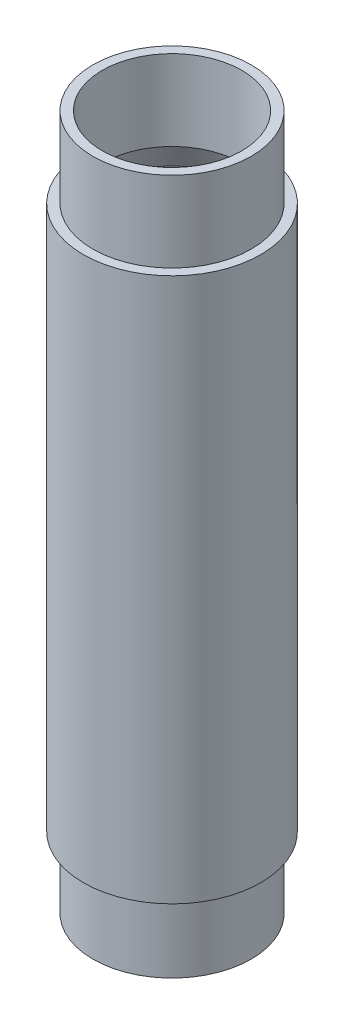
ISO-10303-21;
HEADER;
FILE_DESCRIPTION(('STEP AP214'),'2;1');
FILE_NAME('part.step','',(''),(''),'','','');
FILE_SCHEMA(('AUTOMOTIVE_DESIGN { 1 0 10303 214 1 1 1 1 }'));
ENDSEC;
DATA;
#1=APPLICATION_CONTEXT('core data for automotive mechanical design processes');
#2=APPLICATION_PROTOCOL_DEFINITION('international standard','automotive_design',2000,#1);
#3=PRODUCT_CONTEXT('',#1,'mechanical');
#4=PRODUCT('Part','Part','',(#3));
#5=PRODUCT_RELATED_PRODUCT_CATEGORY('part','',(#4));
#6=PRODUCT_DEFINITION_FORMATION('','',#4);
#7=PRODUCT_DEFINITION_CONTEXT('part definition',#1,'design');
#8=PRODUCT_DEFINITION('design','',#6,#7);
#9=PRODUCT_DEFINITION_SHAPE('','',#8);
#10=(LENGTH_UNIT() NAMED_UNIT(*) SI_UNIT(.MILLI.,.METRE.));
#11=(NAMED_UNIT(*) PLANE_ANGLE_UNIT() SI_UNIT($,.RADIAN.));
#12=(NAMED_UNIT(*) SI_UNIT($,.STERADIAN.) SOLID_ANGLE_UNIT());
#13=UNCERTAINTY_MEASURE_WITH_UNIT(LENGTH_MEASURE(1.E-05),#10,'distance_accuracy_value','');
#14=(GEOMETRIC_REPRESENTATION_CONTEXT(3) GLOBAL_UNCERTAINTY_ASSIGNED_CONTEXT((#13)) GLOBAL_UNIT_ASSIGNED_CONTEXT((#10,
#11,#12)) REPRESENTATION_CONTEXT('',''));
#15=CARTESIAN_POINT('',(0.,0.,0.));
#16=DIRECTION('',(0.,0.,1.));
#17=DIRECTION('',(1.,0.,0.));
#18=AXIS2_PLACEMENT_3D('',#15,#16,#17);
#19=CARTESIAN_POINT('',(0.,264.,0.));
#20=DIRECTION('',(0.,-1.,0.));
#21=DIRECTION('',(0.,0.,-1.));
#22=AXIS2_PLACEMENT_3D('',#19,#20,#21);
#23=CYLINDRICAL_SURFACE('',#22,33.5);
#24=CARTESIAN_POINT('',(0.,264.,0.));
#25=DIRECTION('',(0.,-1.,0.));
#26=DIRECTION('',(0.,0.,-1.));
#27=AXIS2_PLACEMENT_3D('',#24,#25,#26);
#28=CIRCLE('',#27,33.5);
#29=CARTESIAN_POINT('',(0.,264.,-33.5));
#30=VERTEX_POINT('',#29);
#31=EDGE_CURVE('E11',#30,#30,#28,.T.);
#32=ORIENTED_EDGE('',*,*,#31,.T.);
#33=EDGE_LOOP('',(#32));
#34=FACE_BOUND('',#33,.T.);
#35=CARTESIAN_POINT('',(0.,230.,0.));
#36=DIRECTION('',(0.,-1.,0.));
#37=DIRECTION('',(0.,0.,-1.));
#38=AXIS2_PLACEMENT_3D('',#35,#36,#37);
#39=CIRCLE('',#38,33.5);
#40=CARTESIAN_POINT('',(0.,230.,-33.5));
#41=VERTEX_POINT('',#40);
#42=EDGE_CURVE('E50',#41,#41,#39,.T.);
#43=ORIENTED_EDGE('',*,*,#42,.F.);
#44=EDGE_LOOP('',(#43));
#45=FACE_BOUND('',#44,.T.);
#46=ADVANCED_FACE('F47',(#34,#45),#23,.T.);
#47=CARTESIAN_POINT('',(0.,264.,0.));
#48=DIRECTION('',(0.,-1.,0.));
#49=DIRECTION('',(0.,0.,-1.));
#50=AXIS2_PLACEMENT_3D('',#47,#48,#49);
#51=PLANE('',#50);
#52=CARTESIAN_POINT('',(0.,264.,0.));
#53=DIRECTION('',(0.,-1.,0.));
#54=DIRECTION('',(0.,0.,-1.));
#55=AXIS2_PLACEMENT_3D('',#52,#53,#54);
#56=CIRCLE('',#55,29.5);
#57=CARTESIAN_POINT('',(0.,264.,-29.5));
#58=VERTEX_POINT('',#57);
#59=EDGE_CURVE('E57',#58,#58,#56,.T.);
#60=ORIENTED_EDGE('',*,*,#59,.T.);
#61=EDGE_LOOP('',(#60));
#62=FACE_BOUND('',#61,.T.);
#63=ORIENTED_EDGE('',*,*,#31,.F.);
#64=EDGE_LOOP('',(#63));
#65=FACE_BOUND('',#64,.T.);
#66=ADVANCED_FACE('F65',(#62,#65),#51,.F.);
#67=CARTESIAN_POINT('',(0.,230.,0.));
#68=DIRECTION('',(0.,-1.,0.));
#69=DIRECTION('',(0.,0.,-1.));
#70=AXIS2_PLACEMENT_3D('',#67,#68,#69);
#71=PLANE('',#70);
#72=CARTESIAN_POINT('',(0.,230.,0.));
#73=DIRECTION('',(0.,-1.,0.));
#74=DIRECTION('',(0.,0.,-1.));
#75=AXIS2_PLACEMENT_3D('',#72,#73,#74);
#76=CIRCLE('',#75,29.5);
#77=CARTESIAN_POINT('',(0.,230.,-29.5));
#78=VERTEX_POINT('',#77);
#79=EDGE_CURVE('E59',#78,#78,#76,.T.);
#80=ORIENTED_EDGE('',*,*,#79,.F.);
#81=EDGE_LOOP('',(#80));
#82=FACE_BOUND('',#81,.T.);
#83=ORIENTED_EDGE('',*,*,#42,.T.);
#84=EDGE_LOOP('',(#83));
#85=FACE_BOUND('',#84,.T.);
#86=ADVANCED_FACE('F71',(#82,#85),#71,.T.);
#87=CARTESIAN_POINT('',(0.,264.,0.));
#88=DIRECTION('',(0.,-1.,0.));
#89=DIRECTION('',(0.,0.,-1.));
#90=AXIS2_PLACEMENT_3D('',#87,#88,#89);
#91=CYLINDRICAL_SURFACE('',#90,29.5);
#92=ORIENTED_EDGE('',*,*,#59,.F.);
#93=EDGE_LOOP('',(#92));
#94=FACE_BOUND('',#93,.T.);
#95=ORIENTED_EDGE('',*,*,#79,.T.);
#96=EDGE_LOOP('',(#95));
#97=FACE_BOUND('',#96,.T.);
#98=ADVANCED_FACE('F68',(#94,#97),#91,.F.);
#99=CLOSED_SHELL('',(#46,#66,#86,#98));
#100=MANIFOLD_SOLID_BREP('B2',#99);
#101=CARTESIAN_POINT('',(0.,230.,0.));
#102=DIRECTION('',(0.,-1.,0.));
#103=DIRECTION('',(0.,0.,-1.));
#104=AXIS2_PLACEMENT_3D('',#101,#102,#103);
#105=CYLINDRICAL_SURFACE('',#104,33.5);
#106=CARTESIAN_POINT('',(0.,14.,0.));
#107=DIRECTION('',(0.,1.,0.));
#108=DIRECTION('',(0.,0.,1.));
#109=AXIS2_PLACEMENT_3D('',#106,#107,#108);
#110=CIRCLE('',#109,33.5);
#111=CARTESIAN_POINT('',(0.,14.,33.5));
#112=VERTEX_POINT('',#111);
#113=EDGE_CURVE('E46',#112,#112,#110,.T.);
#114=ORIENTED_EDGE('',*,*,#113,.F.);
#115=EDGE_LOOP('',(#114));
#116=FACE_BOUND('',#115,.T.);
#117=CARTESIAN_POINT('',(0.,220.,0.));
#118=DIRECTION('',(0.,-1.,0.));
#119=DIRECTION('',(0.,0.,-1.));
#120=AXIS2_PLACEMENT_3D('',#117,#118,#119);
#121=CIRCLE('',#120,33.5);
#122=CARTESIAN_POINT('',(0.,220.,-33.5));
#123=VERTEX_POINT('',#122);
#124=EDGE_CURVE('E124',#123,#123,#121,.T.);
#125=ORIENTED_EDGE('',*,*,#124,.F.);
#126=EDGE_LOOP('',(#125));
#127=FACE_BOUND('',#126,.T.);
#128=ADVANCED_FACE('F117',(#116,#127),#105,.F.);
#129=CARTESIAN_POINT('',(0.,230.,0.));
#130=DIRECTION('',(0.,1.,0.));
#131=DIRECTION('',(0.,0.,1.));
#132=AXIS2_PLACEMENT_3D('',#129,#130,#131);
#133=PLANE('',#132);
#134=CARTESIAN_POINT('',(0.,230.,0.));
#135=DIRECTION('',(0.,1.,0.));
#136=DIRECTION('',(0.,0.,1.));
#137=AXIS2_PLACEMENT_3D('',#134,#135,#136);
#138=CIRCLE('',#137,37.5);
#139=CARTESIAN_POINT('',(0.,230.,37.5));
#140=VERTEX_POINT('',#139);
#141=EDGE_CURVE('E128',#140,#140,#138,.T.);
#142=ORIENTED_EDGE('',*,*,#141,.T.);
#143=EDGE_LOOP('',(#142));
#144=FACE_BOUND('',#143,.T.);
#145=CARTESIAN_POINT('',(0.,230.,0.));
#146=DIRECTION('',(0.,1.,0.));
#147=DIRECTION('',(0.,0.,1.));
#148=AXIS2_PLACEMENT_3D('',#145,#146,#147);
#149=CIRCLE('',#148,29.5);
#150=CARTESIAN_POINT('',(0.,230.,29.5));
#151=VERTEX_POINT('',#150);
#152=EDGE_CURVE('E149',#151,#151,#149,.T.);
#153=ORIENTED_EDGE('',*,*,#152,.F.);
#154=EDGE_LOOP('',(#153));
#155=FACE_BOUND('',#154,.T.);
#156=ADVANCED_FACE('F155',(#144,#155),#133,.T.);
#157=CARTESIAN_POINT('',(0.,0.,0.));
#158=DIRECTION('',(0.,1.,0.));
#159=DIRECTION('',(0.,0.,1.));
#160=AXIS2_PLACEMENT_3D('',#157,#158,#159);
#161=PLANE('',#160);
#162=CARTESIAN_POINT('',(0.,0.,0.));
#163=DIRECTION('',(0.,1.,0.));
#164=DIRECTION('',(0.,0.,1.));
#165=AXIS2_PLACEMENT_3D('',#162,#163,#164);
#166=CIRCLE('',#165,37.5);
#167=CARTESIAN_POINT('',(0.,0.,37.5));
#168=VERTEX_POINT('',#167);
#169=EDGE_CURVE('E132',#168,#168,#166,.T.);
#170=ORIENTED_EDGE('',*,*,#169,.F.);
#171=EDGE_LOOP('',(#170));
#172=FACE_BOUND('',#171,.T.);
#173=CARTESIAN_POINT('',(0.,0.,0.));
#174=DIRECTION('',(0.,1.,0.));
#175=DIRECTION('',(0.,0.,1.));
#176=AXIS2_PLACEMENT_3D('',#173,#174,#175);
#177=CIRCLE('',#176,33.5);
#178=CARTESIAN_POINT('',(0.,0.,33.5));
#179=VERTEX_POINT('',#178);
#180=EDGE_CURVE('E136',#179,#179,#177,.T.);
#181=ORIENTED_EDGE('',*,*,#180,.T.);
#182=EDGE_LOOP('',(#181));
#183=FACE_BOUND('',#182,.T.);
#184=ADVANCED_FACE('F157',(#172,#183),#161,.F.);
#185=CARTESIAN_POINT('',(0.,230.,0.));
#186=DIRECTION('',(0.,-1.,0.));
#187=DIRECTION('',(0.,0.,-1.));
#188=AXIS2_PLACEMENT_3D('',#185,#186,#187);
#189=CYLINDRICAL_SURFACE('',#188,37.5);
#190=ORIENTED_EDGE('',*,*,#141,.F.);
#191=EDGE_LOOP('',(#190));
#192=FACE_BOUND('',#191,.T.);
#193=ORIENTED_EDGE('',*,*,#169,.T.);
#194=EDGE_LOOP('',(#193));
#195=FACE_BOUND('',#194,.T.);
#196=ADVANCED_FACE('F119',(#192,#195),#189,.T.);
#197=CARTESIAN_POINT('',(0.,4.,0.));
#198=DIRECTION('',(0.,-1.,0.));
#199=DIRECTION('',(0.,0.,-1.));
#200=AXIS2_PLACEMENT_3D('',#197,#198,#199);
#201=CYLINDRICAL_SURFACE('',#200,33.5);
#202=CARTESIAN_POINT('',(0.,-30.,0.));
#203=DIRECTION('',(0.,-1.,0.));
#204=DIRECTION('',(0.,0.,-1.));
#205=AXIS2_PLACEMENT_3D('',#202,#203,#204);
#206=CIRCLE('',#205,33.5);
#207=CARTESIAN_POINT('',(0.,-30.,-33.5));
#208=VERTEX_POINT('',#207);
#209=EDGE_CURVE('E143',#208,#208,#206,.T.);
#210=ORIENTED_EDGE('',*,*,#209,.F.);
#211=EDGE_LOOP('',(#210));
#212=FACE_BOUND('',#211,.T.);
#213=ORIENTED_EDGE('',*,*,#180,.F.);
#214=EDGE_LOOP('',(#213));
#215=FACE_BOUND('',#214,.T.);
#216=ADVANCED_FACE('F168',(#212,#215),#201,.T.);
#217=CARTESIAN_POINT('',(0.,4.,0.));
#218=DIRECTION('',(0.,-1.,0.));
#219=DIRECTION('',(0.,0.,-1.));
#220=AXIS2_PLACEMENT_3D('',#217,#218,#219);
#221=CYLINDRICAL_SURFACE('',#220,29.5);
#222=CARTESIAN_POINT('',(0.,4.,0.));
#223=DIRECTION('',(0.,-1.,0.));
#224=DIRECTION('',(0.,0.,-1.));
#225=AXIS2_PLACEMENT_3D('',#222,#223,#224);
#226=CIRCLE('',#225,29.5);
#227=CARTESIAN_POINT('',(0.,4.,-29.5));
#228=VERTEX_POINT('',#227);
#229=EDGE_CURVE('E140',#228,#228,#226,.T.);
#230=ORIENTED_EDGE('',*,*,#229,.F.);
#231=EDGE_LOOP('',(#230));
#232=FACE_BOUND('',#231,.T.);
#233=CARTESIAN_POINT('',(0.,-30.,0.));
#234=DIRECTION('',(0.,-1.,0.));
#235=DIRECTION('',(0.,0.,-1.));
#236=AXIS2_PLACEMENT_3D('',#233,#234,#235);
#237=CIRCLE('',#236,29.5);
#238=CARTESIAN_POINT('',(0.,-30.,-29.5));
#239=VERTEX_POINT('',#238);
#240=EDGE_CURVE('E146',#239,#239,#237,.T.);
#241=ORIENTED_EDGE('',*,*,#240,.T.);
#242=EDGE_LOOP('',(#241));
#243=FACE_BOUND('',#242,.T.);
#244=ADVANCED_FACE('F171',(#232,#243),#221,.F.);
#245=CARTESIAN_POINT('',(0.,-30.,0.));
#246=DIRECTION('',(0.,-1.,0.));
#247=DIRECTION('',(0.,0.,-1.));
#248=AXIS2_PLACEMENT_3D('',#245,#246,#247);
#249=PLANE('',#248);
#250=ORIENTED_EDGE('',*,*,#209,.T.);
#251=EDGE_LOOP('',(#250));
#252=FACE_BOUND('',#251,.T.);
#253=ORIENTED_EDGE('',*,*,#240,.F.);
#254=EDGE_LOOP('',(#253));
#255=FACE_BOUND('',#254,.T.);
#256=ADVANCED_FACE('F175',(#252,#255),#249,.T.);
#257=CARTESIAN_POINT('',(0.,220.,0.));
#258=DIRECTION('',(0.,-1.,0.));
#259=DIRECTION('',(0.,0.,-1.));
#260=AXIS2_PLACEMENT_3D('',#257,#258,#259);
#261=CONICAL_SURFACE('',#260,33.5,0.380506377112364);
#262=ORIENTED_EDGE('',*,*,#152,.T.);
#263=EDGE_LOOP('',(#262));
#264=FACE_BOUND('',#263,.T.);
#265=ORIENTED_EDGE('',*,*,#124,.T.);
#266=EDGE_LOOP('',(#265));
#267=FACE_BOUND('',#266,.T.);
#268=ADVANCED_FACE('F153',(#264,#267),#261,.F.);
#269=CARTESIAN_POINT('',(0.,4.,0.));
#270=DIRECTION('',(0.,1.,0.));
#271=DIRECTION('',(0.,0.,1.));
#272=AXIS2_PLACEMENT_3D('',#269,#270,#271);
#273=CONICAL_SURFACE('',#272,29.5,0.380506377112364);
#274=ORIENTED_EDGE('',*,*,#113,.T.);
#275=EDGE_LOOP('',(#274));
#276=FACE_BOUND('',#275,.T.);
#277=ORIENTED_EDGE('',*,*,#229,.T.);
#278=EDGE_LOOP('',(#277));
#279=FACE_BOUND('',#278,.T.);
#280=ADVANCED_FACE('F182',(#276,#279),#273,.F.);
#281=CLOSED_SHELL('',(#128,#156,#184,#196,#216,#244,#256,#268,#280));
#282=MANIFOLD_SOLID_BREP('B6',#281);
#283=ADVANCED_BREP_SHAPE_REPRESENTATION('',(#18,#100,#282),#14);
#284=SHAPE_DEFINITION_REPRESENTATION(#9,#283);
ENDSEC;
END-ISO-10303-21;
